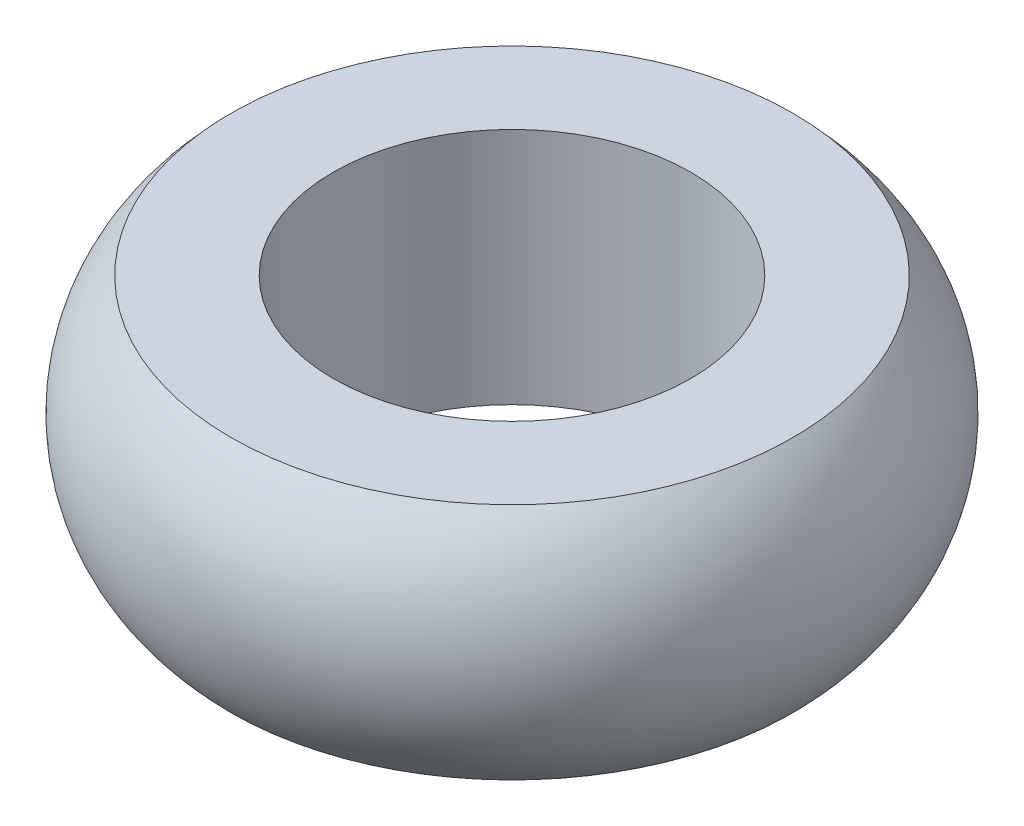
ISO-10303-21;
HEADER;
FILE_DESCRIPTION(('STEP AP214'),'2;1');
FILE_NAME('part.step','',(''),(''),'','','');
FILE_SCHEMA(('AUTOMOTIVE_DESIGN { 1 0 10303 214 1 1 1 1 }'));
ENDSEC;
DATA;
#1=APPLICATION_CONTEXT('core data for automotive mechanical design processes');
#2=APPLICATION_PROTOCOL_DEFINITION('international standard','automotive_design',2000,#1);
#3=PRODUCT_CONTEXT('',#1,'mechanical');
#4=PRODUCT('Part','Part','',(#3));
#5=PRODUCT_RELATED_PRODUCT_CATEGORY('part','',(#4));
#6=PRODUCT_DEFINITION_FORMATION('','',#4);
#7=PRODUCT_DEFINITION_CONTEXT('part definition',#1,'design');
#8=PRODUCT_DEFINITION('design','',#6,#7);
#9=PRODUCT_DEFINITION_SHAPE('','',#8);
#10=(LENGTH_UNIT() NAMED_UNIT(*) SI_UNIT(.MILLI.,.METRE.));
#11=(NAMED_UNIT(*) PLANE_ANGLE_UNIT() SI_UNIT($,.RADIAN.));
#12=(NAMED_UNIT(*) SI_UNIT($,.STERADIAN.) SOLID_ANGLE_UNIT());
#13=UNCERTAINTY_MEASURE_WITH_UNIT(LENGTH_MEASURE(1.E-05),#10,'distance_accuracy_value','');
#14=(GEOMETRIC_REPRESENTATION_CONTEXT(3) GLOBAL_UNCERTAINTY_ASSIGNED_CONTEXT((#13)) GLOBAL_UNIT_ASSIGNED_CONTEXT((#10,
#11,#12)) REPRESENTATION_CONTEXT('',''));
#15=CARTESIAN_POINT('',(0.,0.,0.));
#16=DIRECTION('',(0.,0.,1.));
#17=DIRECTION('',(1.,0.,0.));
#18=AXIS2_PLACEMENT_3D('',#15,#16,#17);
#19=CARTESIAN_POINT('',(-5.25,7.,0.));
#20=DIRECTION('',(0.,-1.,0.));
#21=DIRECTION('',(0.,0.,-1.));
#22=AXIS2_PLACEMENT_3D('',#19,#20,#21);
#23=PLANE('',#22);
#24=CARTESIAN_POINT('',(0.,7.,0.));
#25=DIRECTION('',(0.,-1.,0.));
#26=DIRECTION('',(0.,0.,-1.));
#27=AXIS2_PLACEMENT_3D('',#24,#25,#26);
#28=CIRCLE('',#27,8.25);
#29=CARTESIAN_POINT('',(0.,7.,-8.25));
#30=VERTEX_POINT('',#29);
#31=EDGE_CURVE('E60',#30,#30,#28,.T.);
#32=ORIENTED_EDGE('',*,*,#31,.F.);
#33=EDGE_LOOP('',(#32));
#34=FACE_BOUND('',#33,.T.);
#35=CARTESIAN_POINT('',(0.,7.,0.));
#36=DIRECTION('',(0.,-1.,0.));
#37=DIRECTION('',(0.,0.,-1.));
#38=AXIS2_PLACEMENT_3D('',#35,#36,#37);
#39=CIRCLE('',#38,5.25);
#40=CARTESIAN_POINT('',(0.,7.,-5.25));
#41=VERTEX_POINT('',#40);
#42=EDGE_CURVE('E10',#41,#41,#39,.T.);
#43=ORIENTED_EDGE('',*,*,#42,.T.);
#44=EDGE_LOOP('',(#43));
#45=FACE_BOUND('',#44,.T.);
#46=ADVANCED_FACE('F43',(#34,#45),#23,.F.);
#47=CARTESIAN_POINT('',(0.,0.,0.));
#48=DIRECTION('',(0.,-1.,0.));
#49=DIRECTION('',(0.,0.,-1.));
#50=AXIS2_PLACEMENT_3D('',#47,#48,#49);
#51=CYLINDRICAL_SURFACE('',#50,5.25);
#52=ORIENTED_EDGE('',*,*,#42,.F.);
#53=EDGE_LOOP('',(#52));
#54=FACE_BOUND('',#53,.T.);
#55=CARTESIAN_POINT('',(0.,0.,0.));
#56=DIRECTION('',(0.,-1.,0.));
#57=DIRECTION('',(0.,0.,-1.));
#58=AXIS2_PLACEMENT_3D('',#55,#56,#57);
#59=CIRCLE('',#58,5.25);
#60=CARTESIAN_POINT('',(0.,0.,-5.25));
#61=VERTEX_POINT('',#60);
#62=EDGE_CURVE('E50',#61,#61,#59,.T.);
#63=ORIENTED_EDGE('',*,*,#62,.T.);
#64=EDGE_LOOP('',(#63));
#65=FACE_BOUND('',#64,.T.);
#66=ADVANCED_FACE('F70',(#54,#65),#51,.F.);
#67=CARTESIAN_POINT('',(-5.25,0.,0.));
#68=DIRECTION('',(0.,1.,0.));
#69=DIRECTION('',(0.,0.,1.));
#70=AXIS2_PLACEMENT_3D('',#67,#68,#69);
#71=PLANE('',#70);
#72=ORIENTED_EDGE('',*,*,#62,.F.);
#73=EDGE_LOOP('',(#72));
#74=FACE_BOUND('',#73,.T.);
#75=CARTESIAN_POINT('',(0.,0.,0.));
#76=DIRECTION('',(0.,-1.,0.));
#77=DIRECTION('',(0.,0.,-1.));
#78=AXIS2_PLACEMENT_3D('',#75,#76,#77);
#79=CIRCLE('',#78,8.25);
#80=CARTESIAN_POINT('',(0.,0.,-8.25));
#81=VERTEX_POINT('',#80);
#82=EDGE_CURVE('E55',#81,#81,#79,.T.);
#83=ORIENTED_EDGE('',*,*,#82,.T.);
#84=EDGE_LOOP('',(#83));
#85=FACE_BOUND('',#84,.T.);
#86=ADVANCED_FACE('F74',(#74,#85),#71,.F.);
#87=CARTESIAN_POINT('',(0.,3.5,0.));
#88=DIRECTION('',(0.,-1.,0.));
#89=DIRECTION('',(0.,0.,-1.));
#90=AXIS2_PLACEMENT_3D('',#87,#88,#89);
#91=DEGENERATE_TOROIDAL_SURFACE('',#90,4.67928578572858,5.,.T.);
#92=ORIENTED_EDGE('',*,*,#82,.F.);
#93=EDGE_LOOP('',(#92));
#94=FACE_BOUND('',#93,.T.);
#95=ORIENTED_EDGE('',*,*,#31,.T.);
#96=EDGE_LOOP('',(#95));
#97=FACE_BOUND('',#96,.T.);
#98=ADVANCED_FACE('F67',(#94,#97),#91,.T.);
#99=CLOSED_SHELL('',(#46,#66,#86,#98));
#100=MANIFOLD_SOLID_BREP('B2',#99);
#101=ADVANCED_BREP_SHAPE_REPRESENTATION('',(#18,#100),#14);
#102=SHAPE_DEFINITION_REPRESENTATION(#9,#101);
ENDSEC;
END-ISO-10303-21;
